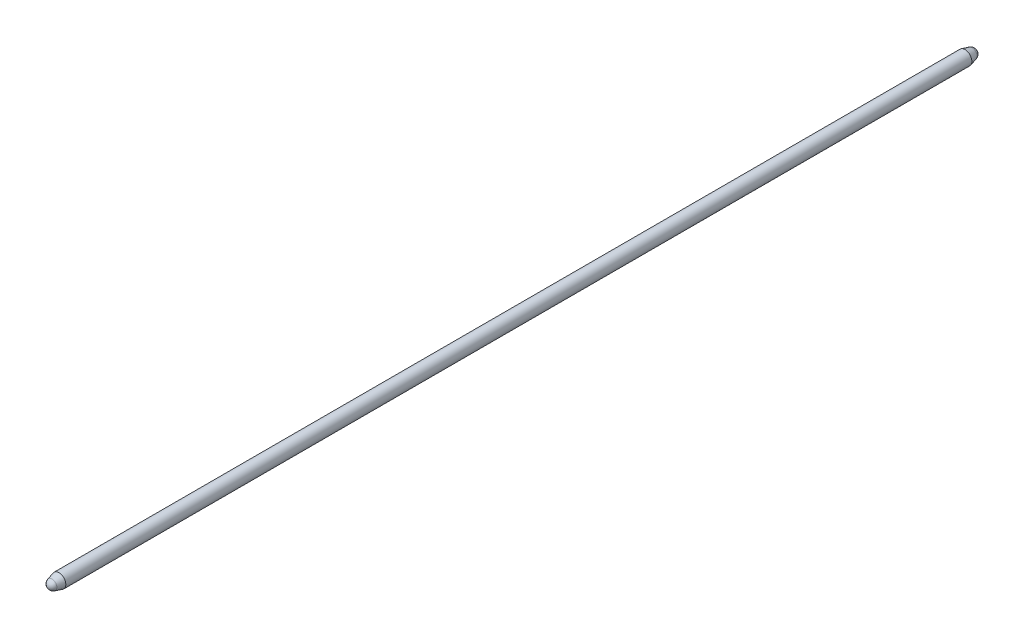
ISO-10303-21;
HEADER;
FILE_DESCRIPTION(('STEP AP214'),'2;1');
FILE_NAME('part.step','',(''),(''),'','','');
FILE_SCHEMA(('AUTOMOTIVE_DESIGN { 1 0 10303 214 1 1 1 1 }'));
ENDSEC;
DATA;
#1=APPLICATION_CONTEXT('core data for automotive mechanical design processes');
#2=APPLICATION_PROTOCOL_DEFINITION('international standard','automotive_design',2000,#1);
#3=PRODUCT_CONTEXT('',#1,'mechanical');
#4=PRODUCT('Part','Part','',(#3));
#5=PRODUCT_RELATED_PRODUCT_CATEGORY('part','',(#4));
#6=PRODUCT_DEFINITION_FORMATION('','',#4);
#7=PRODUCT_DEFINITION_CONTEXT('part definition',#1,'design');
#8=PRODUCT_DEFINITION('design','',#6,#7);
#9=PRODUCT_DEFINITION_SHAPE('','',#8);
#10=(LENGTH_UNIT() NAMED_UNIT(*) SI_UNIT(.MILLI.,.METRE.));
#11=(NAMED_UNIT(*) PLANE_ANGLE_UNIT() SI_UNIT($,.RADIAN.));
#12=(NAMED_UNIT(*) SI_UNIT($,.STERADIAN.) SOLID_ANGLE_UNIT());
#13=UNCERTAINTY_MEASURE_WITH_UNIT(LENGTH_MEASURE(1.E-05),#10,'distance_accuracy_value','');
#14=(GEOMETRIC_REPRESENTATION_CONTEXT(3) GLOBAL_UNCERTAINTY_ASSIGNED_CONTEXT((#13)) GLOBAL_UNIT_ASSIGNED_CONTEXT((#10,
#11,#12)) REPRESENTATION_CONTEXT('',''));
#15=CARTESIAN_POINT('',(0.,0.,0.));
#16=DIRECTION('',(0.,0.,1.));
#17=DIRECTION('',(1.,0.,0.));
#18=AXIS2_PLACEMENT_3D('',#15,#16,#17);
#19=CARTESIAN_POINT('',(0.,0.,-1699.02941514641));
#20=DIRECTION('',(0.,0.,-1.));
#21=DIRECTION('',(0.,1.,0.));
#22=AXIS2_PLACEMENT_3D('',#19,#20,#21);
#23=SPHERICAL_SURFACE('',#22,19.05);
#24=CARTESIAN_POINT('',(0.,0.,-1703.95991795562));
#25=DIRECTION('',(0.,0.,-1.));
#26=DIRECTION('',(0.,1.,0.));
#27=AXIS2_PLACEMENT_3D('',#24,#25,#26);
#28=CIRCLE('',#27,18.4008869908067);
#29=CARTESIAN_POINT('',(0.,18.4008869908068,-1703.95991795562));
#30=VERTEX_POINT('',#29);
#31=EDGE_CURVE('E10',#30,#30,#28,.T.);
#32=ORIENTED_EDGE('',*,*,#31,.T.);
#33=EDGE_LOOP('',(#32));
#34=FACE_BOUND('',#33,.T.);
#35=ADVANCED_FACE('F31',(#34),#23,.T.);
#36=CARTESIAN_POINT('',(0.,0.,-1703.95991795562));
#37=DIRECTION('',(0.,0.,1.));
#38=DIRECTION('',(0.,-1.,0.));
#39=AXIS2_PLACEMENT_3D('',#36,#37,#38);
#40=CONICAL_SURFACE('',#39,18.4008869908067,0.26179938779915);
#41=CARTESIAN_POINT('',(0.,0.,-1677.83887259739));
#42=DIRECTION('',(0.,0.,-1.));
#43=DIRECTION('',(0.,1.,0.));
#44=AXIS2_PLACEMENT_3D('',#41,#42,#43);
#45=CIRCLE('',#44,25.4);
#46=CARTESIAN_POINT('',(0.,25.4,-1677.83887259739));
#47=VERTEX_POINT('',#46);
#48=EDGE_CURVE('E38',#47,#47,#45,.T.);
#49=ORIENTED_EDGE('',*,*,#48,.T.);
#50=EDGE_LOOP('',(#49));
#51=FACE_BOUND('',#50,.T.);
#52=ORIENTED_EDGE('',*,*,#31,.F.);
#53=EDGE_LOOP('',(#52));
#54=FACE_BOUND('',#53,.T.);
#55=ADVANCED_FACE('F86',(#51,#54),#40,.T.);
#56=CARTESIAN_POINT('',(0.,0.,-1718.07941514641));
#57=DIRECTION('',(0.,0.,-1.));
#58=DIRECTION('',(0.,1.,0.));
#59=AXIS2_PLACEMENT_3D('',#56,#57,#58);
#60=CYLINDRICAL_SURFACE('',#59,25.4);
#61=CARTESIAN_POINT('',(0.,0.,1677.83887259739));
#62=DIRECTION('',(0.,0.,-1.));
#63=DIRECTION('',(0.,1.,0.));
#64=AXIS2_PLACEMENT_3D('',#61,#62,#63);
#65=CIRCLE('',#64,25.4);
#66=CARTESIAN_POINT('',(0.,25.4,1677.83887259739));
#67=VERTEX_POINT('',#66);
#68=EDGE_CURVE('E42',#67,#67,#65,.T.);
#69=ORIENTED_EDGE('',*,*,#68,.T.);
#70=EDGE_LOOP('',(#69));
#71=FACE_BOUND('',#70,.T.);
#72=ORIENTED_EDGE('',*,*,#48,.F.);
#73=EDGE_LOOP('',(#72));
#74=FACE_BOUND('',#73,.T.);
#75=ADVANCED_FACE('F83',(#71,#74),#60,.T.);
#76=CARTESIAN_POINT('',(0.,0.,1677.83887259739));
#77=DIRECTION('',(0.,0.,-1.));
#78=DIRECTION('',(0.,1.,0.));
#79=AXIS2_PLACEMENT_3D('',#76,#77,#78);
#80=CONICAL_SURFACE('',#79,25.4,0.26179938779915);
#81=CARTESIAN_POINT('',(0.,0.,1703.95991795562));
#82=DIRECTION('',(0.,0.,-1.));
#83=DIRECTION('',(0.,1.,0.));
#84=AXIS2_PLACEMENT_3D('',#81,#82,#83);
#85=CIRCLE('',#84,18.4008869908068);
#86=CARTESIAN_POINT('',(0.,18.4008869908068,1703.95991795562));
#87=VERTEX_POINT('',#86);
#88=EDGE_CURVE('E46',#87,#87,#85,.T.);
#89=ORIENTED_EDGE('',*,*,#88,.T.);
#90=EDGE_LOOP('',(#89));
#91=FACE_BOUND('',#90,.T.);
#92=ORIENTED_EDGE('',*,*,#68,.F.);
#93=EDGE_LOOP('',(#92));
#94=FACE_BOUND('',#93,.T.);
#95=ADVANCED_FACE('F79',(#91,#94),#80,.T.);
#96=CARTESIAN_POINT('',(0.,0.,1699.02941514641));
#97=DIRECTION('',(0.,0.,-1.));
#98=DIRECTION('',(0.,1.,0.));
#99=AXIS2_PLACEMENT_3D('',#96,#97,#98);
#100=SPHERICAL_SURFACE('',#99,19.05);
#101=ORIENTED_EDGE('',*,*,#88,.F.);
#102=EDGE_LOOP('',(#101));
#103=FACE_BOUND('',#102,.T.);
#104=ADVANCED_FACE('F77',(#103),#100,.T.);
#105=CLOSED_SHELL('',(#35,#55,#75,#95,#104));
#106=CARTESIAN_POINT('',(0.,0.,1677.83887259739));
#107=DIRECTION('',(0.,0.,-1.));
#108=DIRECTION('',(0.,1.,0.));
#109=AXIS2_PLACEMENT_3D('',#106,#107,#108);
#110=PLANE('',#109);
#111=CARTESIAN_POINT('',(0.,0.,1677.83887259739));
#112=DIRECTION('',(0.,0.,-1.));
#113=DIRECTION('',(0.,1.,0.));
#114=AXIS2_PLACEMENT_3D('',#111,#112,#113);
#115=CIRCLE('',#114,22.987);
#116=CARTESIAN_POINT('',(0.,22.987,1677.83887259739));
#117=VERTEX_POINT('',#116);
#118=EDGE_CURVE('E51',#117,#117,#115,.T.);
#119=ORIENTED_EDGE('',*,*,#118,.T.);
#120=EDGE_LOOP('',(#119));
#121=FACE_BOUND('',#120,.T.);
#122=ADVANCED_FACE('F68',(#121),#110,.T.);
#123=CARTESIAN_POINT('',(0.,0.,-1718.07941514641));
#124=DIRECTION('',(0.,0.,-1.));
#125=DIRECTION('',(0.,1.,0.));
#126=AXIS2_PLACEMENT_3D('',#123,#124,#125);
#127=CYLINDRICAL_SURFACE('',#126,22.987);
#128=CARTESIAN_POINT('',(0.,0.,-1677.83887259739));
#129=DIRECTION('',(0.,0.,-1.));
#130=DIRECTION('',(0.,1.,0.));
#131=AXIS2_PLACEMENT_3D('',#128,#129,#130);
#132=CIRCLE('',#131,22.987);
#133=CARTESIAN_POINT('',(0.,22.987,-1677.83887259739));
#134=VERTEX_POINT('',#133);
#135=EDGE_CURVE('E54',#134,#134,#132,.T.);
#136=ORIENTED_EDGE('',*,*,#135,.T.);
#137=EDGE_LOOP('',(#136));
#138=FACE_BOUND('',#137,.T.);
#139=ORIENTED_EDGE('',*,*,#118,.F.);
#140=EDGE_LOOP('',(#139));
#141=FACE_BOUND('',#140,.T.);
#142=ADVANCED_FACE('F58',(#138,#141),#127,.F.);
#143=CARTESIAN_POINT('',(0.,0.,-1677.83887259739));
#144=DIRECTION('',(0.,0.,1.));
#145=DIRECTION('',(0.,-1.,0.));
#146=AXIS2_PLACEMENT_3D('',#143,#144,#145);
#147=PLANE('',#146);
#148=ORIENTED_EDGE('',*,*,#135,.F.);
#149=EDGE_LOOP('',(#148));
#150=FACE_BOUND('',#149,.T.);
#151=ADVANCED_FACE('F61',(#150),#147,.T.);
#152=CLOSED_SHELL('',(#122,#142,#151));
#153=ORIENTED_CLOSED_SHELL('',*,#152,.T.);
#154=BREP_WITH_VOIDS('B2',#105,(#153));
#155=ADVANCED_BREP_SHAPE_REPRESENTATION('',(#18,#154),#14);
#156=SHAPE_DEFINITION_REPRESENTATION(#9,#155);
ENDSEC;
END-ISO-10303-21;
